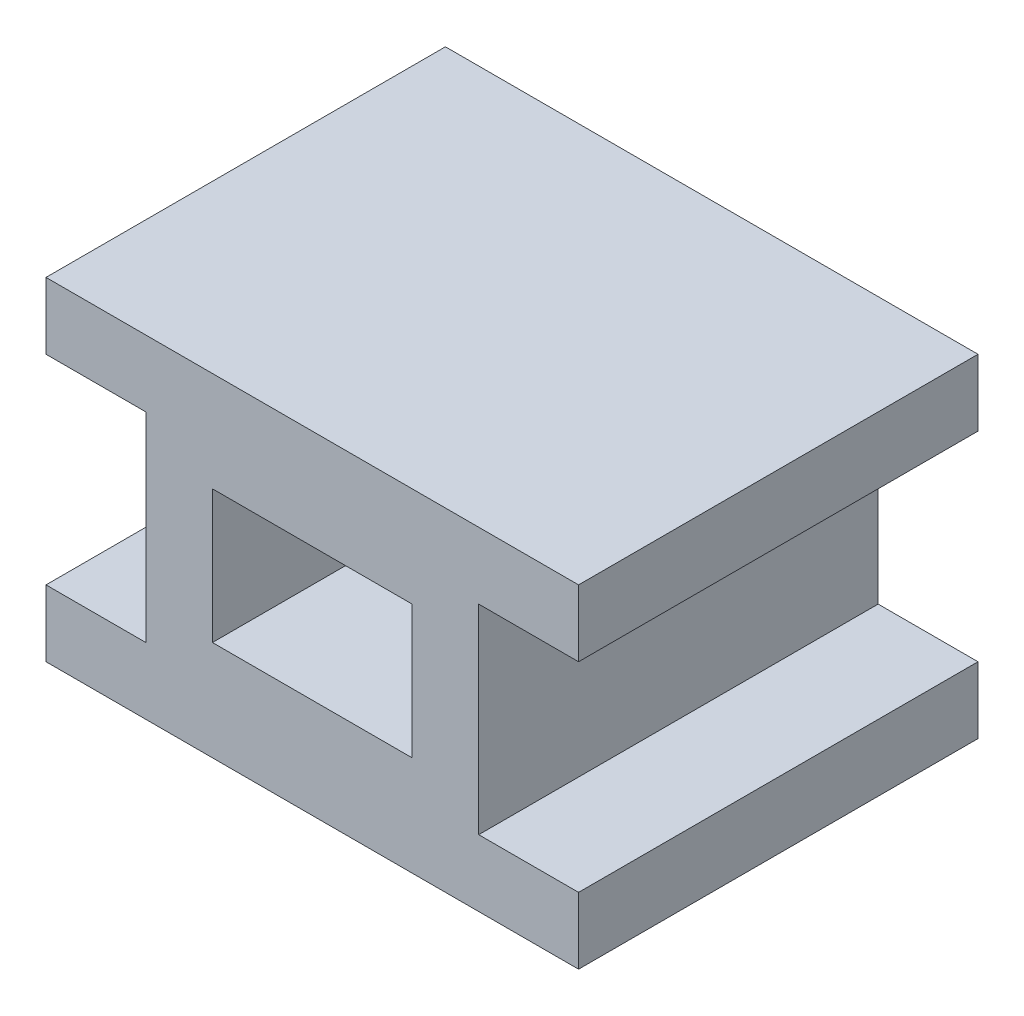
ISO-10303-21;
HEADER;
FILE_DESCRIPTION(('STEP AP214'),'2;1');
FILE_NAME('part.step','',(''),(''),'','','');
FILE_SCHEMA(('AUTOMOTIVE_DESIGN { 1 0 10303 214 1 1 1 1 }'));
ENDSEC;
DATA;
#1=APPLICATION_CONTEXT('core data for automotive mechanical design processes');
#2=APPLICATION_PROTOCOL_DEFINITION('international standard','automotive_design',2000,#1);
#3=PRODUCT_CONTEXT('',#1,'mechanical');
#4=PRODUCT('Part','Part','',(#3));
#5=PRODUCT_RELATED_PRODUCT_CATEGORY('part','',(#4));
#6=PRODUCT_DEFINITION_FORMATION('','',#4);
#7=PRODUCT_DEFINITION_CONTEXT('part definition',#1,'design');
#8=PRODUCT_DEFINITION('design','',#6,#7);
#9=PRODUCT_DEFINITION_SHAPE('','',#8);
#10=(LENGTH_UNIT() NAMED_UNIT(*) SI_UNIT(.MILLI.,.METRE.));
#11=(NAMED_UNIT(*) PLANE_ANGLE_UNIT() SI_UNIT($,.RADIAN.));
#12=(NAMED_UNIT(*) SI_UNIT($,.STERADIAN.) SOLID_ANGLE_UNIT());
#13=UNCERTAINTY_MEASURE_WITH_UNIT(LENGTH_MEASURE(1.E-05),#10,'distance_accuracy_value','');
#14=(GEOMETRIC_REPRESENTATION_CONTEXT(3) GLOBAL_UNCERTAINTY_ASSIGNED_CONTEXT((#13)) GLOBAL_UNIT_ASSIGNED_CONTEXT((#10,
#11,#12)) REPRESENTATION_CONTEXT('',''));
#15=CARTESIAN_POINT('',(0.,0.,0.));
#16=DIRECTION('',(0.,0.,1.));
#17=DIRECTION('',(1.,0.,0.));
#18=AXIS2_PLACEMENT_3D('',#15,#16,#17);
#19=CARTESIAN_POINT('',(0.,0.,30.));
#20=DIRECTION('',(0.,0.,-1.));
#21=DIRECTION('',(-1.,0.,0.));
#22=AXIS2_PLACEMENT_3D('',#19,#20,#21);
#23=PLANE('',#22);
#24=DIRECTION('',(0.,-1.,0.));
#25=VECTOR('',#24,1.);
#26=CARTESIAN_POINT('',(-46.7704918032787,-36.4426229508197,30.));
#27=LINE('',#26,#25);
#28=CARTESIAN_POINT('',(-46.7704918032787,-26.4426229508197,30.));
#29=VERTEX_POINT('',#28);
#30=CARTESIAN_POINT('',(-46.7704918032787,-36.4426229508197,30.));
#31=VERTEX_POINT('',#30);
#32=EDGE_CURVE('E205',#29,#31,#27,.T.);
#33=ORIENTED_EDGE('',*,*,#32,.T.);
#34=DIRECTION('',(1.,0.,0.));
#35=VECTOR('',#34,1.);
#36=CARTESIAN_POINT('',(33.2295081967213,-36.4426229508197,30.));
#37=LINE('',#36,#35);
#38=CARTESIAN_POINT('',(33.2295081967213,-36.4426229508197,30.));
#39=VERTEX_POINT('',#38);
#40=EDGE_CURVE('E209',#31,#39,#37,.T.);
#41=ORIENTED_EDGE('',*,*,#40,.T.);
#42=DIRECTION('',(0.,1.,0.));
#43=VECTOR('',#42,1.);
#44=CARTESIAN_POINT('',(33.2295081967213,-36.4426229508197,30.));
#45=LINE('',#44,#43);
#46=CARTESIAN_POINT('',(33.2295081967213,-26.4426229508197,30.));
#47=VERTEX_POINT('',#46);
#48=EDGE_CURVE('E213',#39,#47,#45,.T.);
#49=ORIENTED_EDGE('',*,*,#48,.T.);
#50=DIRECTION('',(-1.,0.,0.));
#51=VECTOR('',#50,1.);
#52=CARTESIAN_POINT('',(33.2295081967213,-26.4426229508197,30.));
#53=LINE('',#52,#51);
#54=CARTESIAN_POINT('',(18.2295081967213,-26.4426229508197,30.));
#55=VERTEX_POINT('',#54);
#56=EDGE_CURVE('E216',#47,#55,#53,.T.);
#57=ORIENTED_EDGE('',*,*,#56,.T.);
#58=DIRECTION('',(0.,1.,0.));
#59=VECTOR('',#58,1.);
#60=CARTESIAN_POINT('',(18.2295081967213,-26.4426229508197,30.));
#61=LINE('',#60,#59);
#62=CARTESIAN_POINT('',(18.2295081967213,3.55737704918032,30.));
#63=VERTEX_POINT('',#62);
#64=EDGE_CURVE('E219',#55,#63,#61,.T.);
#65=ORIENTED_EDGE('',*,*,#64,.T.);
#66=DIRECTION('',(1.,0.,0.));
#67=VECTOR('',#66,1.);
#68=CARTESIAN_POINT('',(18.2295081967213,3.55737704918032,30.));
#69=LINE('',#68,#67);
#70=CARTESIAN_POINT('',(33.2295081967213,3.55737704918032,30.));
#71=VERTEX_POINT('',#70);
#72=EDGE_CURVE('E222',#63,#71,#69,.T.);
#73=ORIENTED_EDGE('',*,*,#72,.T.);
#74=DIRECTION('',(0.,1.,0.));
#75=VECTOR('',#74,1.);
#76=CARTESIAN_POINT('',(33.2295081967213,3.55737704918032,30.));
#77=LINE('',#76,#75);
#78=CARTESIAN_POINT('',(33.2295081967213,13.5573770491803,30.));
#79=VERTEX_POINT('',#78);
#80=EDGE_CURVE('E225',#71,#79,#77,.T.);
#81=ORIENTED_EDGE('',*,*,#80,.T.);
#82=DIRECTION('',(-1.,0.,0.));
#83=VECTOR('',#82,1.);
#84=CARTESIAN_POINT('',(-46.7704918032787,13.5573770491803,30.));
#85=LINE('',#84,#83);
#86=CARTESIAN_POINT('',(-46.7704918032787,13.5573770491803,30.));
#87=VERTEX_POINT('',#86);
#88=EDGE_CURVE('E228',#79,#87,#85,.T.);
#89=ORIENTED_EDGE('',*,*,#88,.T.);
#90=DIRECTION('',(0.,-1.,0.));
#91=VECTOR('',#90,1.);
#92=CARTESIAN_POINT('',(-46.7704918032787,3.55737704918032,30.));
#93=LINE('',#92,#91);
#94=CARTESIAN_POINT('',(-46.7704918032787,3.55737704918032,30.));
#95=VERTEX_POINT('',#94);
#96=EDGE_CURVE('E231',#87,#95,#93,.T.);
#97=ORIENTED_EDGE('',*,*,#96,.T.);
#98=DIRECTION('',(1.,0.,0.));
#99=VECTOR('',#98,1.);
#100=CARTESIAN_POINT('',(-31.7704918032787,3.55737704918032,30.));
#101=LINE('',#100,#99);
#102=CARTESIAN_POINT('',(-31.7704918032787,3.55737704918032,30.));
#103=VERTEX_POINT('',#102);
#104=EDGE_CURVE('E234',#95,#103,#101,.T.);
#105=ORIENTED_EDGE('',*,*,#104,.T.);
#106=DIRECTION('',(0.,-1.,0.));
#107=VECTOR('',#106,1.);
#108=CARTESIAN_POINT('',(-31.7704918032787,-26.4426229508197,30.));
#109=LINE('',#108,#107);
#110=CARTESIAN_POINT('',(-31.7704918032787,-26.4426229508197,30.));
#111=VERTEX_POINT('',#110);
#112=EDGE_CURVE('E237',#103,#111,#109,.T.);
#113=ORIENTED_EDGE('',*,*,#112,.T.);
#114=DIRECTION('',(-1.,0.,0.));
#115=VECTOR('',#114,1.);
#116=CARTESIAN_POINT('',(-46.7704918032787,-26.4426229508197,30.));
#117=LINE('',#116,#115);
#118=EDGE_CURVE('E240',#111,#29,#117,.T.);
#119=ORIENTED_EDGE('',*,*,#118,.T.);
#120=EDGE_LOOP('',(#33,#41,#49,#57,#65,#73,#81,#89,#97,#105,#113,#119));
#121=FACE_BOUND('',#120,.T.);
#122=DIRECTION('',(0.,-1.,0.));
#123=VECTOR('',#122,1.);
#124=CARTESIAN_POINT('',(-21.7704918032787,-1.44262295081968,30.));
#125=LINE('',#124,#123);
#126=CARTESIAN_POINT('',(-21.7704918032787,-1.44262295081968,30.));
#127=VERTEX_POINT('',#126);
#128=CARTESIAN_POINT('',(-21.7704918032787,-21.4426229508197,30.));
#129=VERTEX_POINT('',#128);
#130=EDGE_CURVE('E157',#127,#129,#125,.T.);
#131=ORIENTED_EDGE('',*,*,#130,.F.);
#132=DIRECTION('',(-1.,0.,0.));
#133=VECTOR('',#132,1.);
#134=CARTESIAN_POINT('',(-21.7704918032787,-1.44262295081968,30.));
#135=LINE('',#134,#133);
#136=CARTESIAN_POINT('',(8.22950819672134,-1.44262295081967,30.));
#137=VERTEX_POINT('',#136);
#138=EDGE_CURVE('E183',#137,#127,#135,.T.);
#139=ORIENTED_EDGE('',*,*,#138,.F.);
#140=DIRECTION('',(0.,1.,0.));
#141=VECTOR('',#140,1.);
#142=CARTESIAN_POINT('',(8.22950819672134,-1.44262295081967,30.));
#143=LINE('',#142,#141);
#144=CARTESIAN_POINT('',(8.22950819672134,-21.4426229508197,30.));
#145=VERTEX_POINT('',#144);
#146=EDGE_CURVE('E179',#145,#137,#143,.T.);
#147=ORIENTED_EDGE('',*,*,#146,.F.);
#148=DIRECTION('',(1.,0.,0.));
#149=VECTOR('',#148,1.);
#150=CARTESIAN_POINT('',(-21.7704918032787,-21.4426229508197,30.));
#151=LINE('',#150,#149);
#152=EDGE_CURVE('E166',#129,#145,#151,.T.);
#153=ORIENTED_EDGE('',*,*,#152,.F.);
#154=EDGE_LOOP('',(#131,#139,#147,#153));
#155=FACE_BOUND('',#154,.T.);
#156=ADVANCED_FACE('F43',(#121,#155),#23,.F.);
#157=CARTESIAN_POINT('',(0.,0.,-30.));
#158=DIRECTION('',(0.,0.,-1.));
#159=DIRECTION('',(-1.,0.,0.));
#160=AXIS2_PLACEMENT_3D('',#157,#158,#159);
#161=PLANE('',#160);
#162=DIRECTION('',(0.,-1.,0.));
#163=VECTOR('',#162,1.);
#164=CARTESIAN_POINT('',(-46.7704918032787,-36.4426229508197,-30.));
#165=LINE('',#164,#163);
#166=CARTESIAN_POINT('',(-46.7704918032787,-26.4426229508197,-30.));
#167=VERTEX_POINT('',#166);
#168=CARTESIAN_POINT('',(-46.7704918032787,-36.4426229508197,-30.));
#169=VERTEX_POINT('',#168);
#170=EDGE_CURVE('E175',#167,#169,#165,.T.);
#171=ORIENTED_EDGE('',*,*,#170,.F.);
#172=DIRECTION('',(-1.,0.,0.));
#173=VECTOR('',#172,1.);
#174=CARTESIAN_POINT('',(-46.7704918032787,-26.4426229508197,-30.));
#175=LINE('',#174,#173);
#176=CARTESIAN_POINT('',(-31.7704918032787,-26.4426229508197,-30.));
#177=VERTEX_POINT('',#176);
#178=EDGE_CURVE('E210',#177,#167,#175,.T.);
#179=ORIENTED_EDGE('',*,*,#178,.F.);
#180=DIRECTION('',(0.,-1.,0.));
#181=VECTOR('',#180,1.);
#182=CARTESIAN_POINT('',(-31.7704918032787,-26.4426229508197,-30.));
#183=LINE('',#182,#181);
#184=CARTESIAN_POINT('',(-31.7704918032787,3.55737704918032,-30.));
#185=VERTEX_POINT('',#184);
#186=EDGE_CURVE('E274',#185,#177,#183,.T.);
#187=ORIENTED_EDGE('',*,*,#186,.F.);
#188=DIRECTION('',(1.,0.,0.));
#189=VECTOR('',#188,1.);
#190=CARTESIAN_POINT('',(-31.7704918032787,3.55737704918032,-30.));
#191=LINE('',#190,#189);
#192=CARTESIAN_POINT('',(-46.7704918032787,3.55737704918032,-30.));
#193=VERTEX_POINT('',#192);
#194=EDGE_CURVE('E271',#193,#185,#191,.T.);
#195=ORIENTED_EDGE('',*,*,#194,.F.);
#196=DIRECTION('',(0.,-1.,0.));
#197=VECTOR('',#196,1.);
#198=CARTESIAN_POINT('',(-46.7704918032787,3.55737704918032,-30.));
#199=LINE('',#198,#197);
#200=CARTESIAN_POINT('',(-46.7704918032787,13.5573770491803,-30.));
#201=VERTEX_POINT('',#200);
#202=EDGE_CURVE('E268',#201,#193,#199,.T.);
#203=ORIENTED_EDGE('',*,*,#202,.F.);
#204=DIRECTION('',(-1.,0.,0.));
#205=VECTOR('',#204,1.);
#206=CARTESIAN_POINT('',(-46.7704918032787,13.5573770491803,-30.));
#207=LINE('',#206,#205);
#208=CARTESIAN_POINT('',(33.2295081967213,13.5573770491803,-30.));
#209=VERTEX_POINT('',#208);
#210=EDGE_CURVE('E265',#209,#201,#207,.T.);
#211=ORIENTED_EDGE('',*,*,#210,.F.);
#212=DIRECTION('',(0.,1.,0.));
#213=VECTOR('',#212,1.);
#214=CARTESIAN_POINT('',(33.2295081967213,3.55737704918032,-30.));
#215=LINE('',#214,#213);
#216=CARTESIAN_POINT('',(33.2295081967213,3.55737704918032,-30.));
#217=VERTEX_POINT('',#216);
#218=EDGE_CURVE('E262',#217,#209,#215,.T.);
#219=ORIENTED_EDGE('',*,*,#218,.F.);
#220=DIRECTION('',(1.,0.,0.));
#221=VECTOR('',#220,1.);
#222=CARTESIAN_POINT('',(18.2295081967213,3.55737704918032,-30.));
#223=LINE('',#222,#221);
#224=CARTESIAN_POINT('',(18.2295081967213,3.55737704918032,-30.));
#225=VERTEX_POINT('',#224);
#226=EDGE_CURVE('E259',#225,#217,#223,.T.);
#227=ORIENTED_EDGE('',*,*,#226,.F.);
#228=DIRECTION('',(0.,1.,0.));
#229=VECTOR('',#228,1.);
#230=CARTESIAN_POINT('',(18.2295081967213,-26.4426229508197,-30.));
#231=LINE('',#230,#229);
#232=CARTESIAN_POINT('',(18.2295081967213,-26.4426229508197,-30.));
#233=VERTEX_POINT('',#232);
#234=EDGE_CURVE('E256',#233,#225,#231,.T.);
#235=ORIENTED_EDGE('',*,*,#234,.F.);
#236=DIRECTION('',(-1.,0.,0.));
#237=VECTOR('',#236,1.);
#238=CARTESIAN_POINT('',(33.2295081967213,-26.4426229508197,-30.));
#239=LINE('',#238,#237);
#240=CARTESIAN_POINT('',(33.2295081967213,-26.4426229508197,-30.));
#241=VERTEX_POINT('',#240);
#242=EDGE_CURVE('E253',#241,#233,#239,.T.);
#243=ORIENTED_EDGE('',*,*,#242,.F.);
#244=DIRECTION('',(0.,1.,0.));
#245=VECTOR('',#244,1.);
#246=CARTESIAN_POINT('',(33.2295081967213,-36.4426229508197,-30.));
#247=LINE('',#246,#245);
#248=CARTESIAN_POINT('',(33.2295081967213,-36.4426229508197,-30.));
#249=VERTEX_POINT('',#248);
#250=EDGE_CURVE('E250',#249,#241,#247,.T.);
#251=ORIENTED_EDGE('',*,*,#250,.F.);
#252=DIRECTION('',(1.,0.,0.));
#253=VECTOR('',#252,1.);
#254=CARTESIAN_POINT('',(33.2295081967213,-36.4426229508197,-30.));
#255=LINE('',#254,#253);
#256=EDGE_CURVE('E247',#169,#249,#255,.T.);
#257=ORIENTED_EDGE('',*,*,#256,.F.);
#258=EDGE_LOOP('',(#171,#179,#187,#195,#203,#211,#219,#227,#235,#243,#251,#257));
#259=FACE_BOUND('',#258,.T.);
#260=DIRECTION('',(-1.,0.,0.));
#261=VECTOR('',#260,1.);
#262=CARTESIAN_POINT('',(-21.7704918032787,-1.44262295081968,-30.));
#263=LINE('',#262,#261);
#264=CARTESIAN_POINT('',(8.22950819672134,-1.44262295081967,-30.));
#265=VERTEX_POINT('',#264);
#266=CARTESIAN_POINT('',(-21.7704918032787,-1.44262295081968,-30.));
#267=VERTEX_POINT('',#266);
#268=EDGE_CURVE('E167',#265,#267,#263,.T.);
#269=ORIENTED_EDGE('',*,*,#268,.T.);
#270=DIRECTION('',(0.,-1.,0.));
#271=VECTOR('',#270,1.);
#272=CARTESIAN_POINT('',(-21.7704918032787,-1.44262295081968,-30.));
#273=LINE('',#272,#271);
#274=CARTESIAN_POINT('',(-21.7704918032787,-21.4426229508197,-30.));
#275=VERTEX_POINT('',#274);
#276=EDGE_CURVE('E67',#267,#275,#273,.T.);
#277=ORIENTED_EDGE('',*,*,#276,.T.);
#278=DIRECTION('',(1.,0.,0.));
#279=VECTOR('',#278,1.);
#280=CARTESIAN_POINT('',(-21.7704918032787,-21.4426229508197,-30.));
#281=LINE('',#280,#279);
#282=CARTESIAN_POINT('',(8.22950819672134,-21.4426229508197,-30.));
#283=VERTEX_POINT('',#282);
#284=EDGE_CURVE('E173',#275,#283,#281,.T.);
#285=ORIENTED_EDGE('',*,*,#284,.T.);
#286=DIRECTION('',(0.,1.,0.));
#287=VECTOR('',#286,1.);
#288=CARTESIAN_POINT('',(8.22950819672134,-1.44262295081967,-30.));
#289=LINE('',#288,#287);
#290=EDGE_CURVE('E192',#283,#265,#289,.T.);
#291=ORIENTED_EDGE('',*,*,#290,.T.);
#292=EDGE_LOOP('',(#269,#277,#285,#291));
#293=FACE_BOUND('',#292,.T.);
#294=ADVANCED_FACE('F329',(#259,#293),#161,.T.);
#295=CARTESIAN_POINT('',(-46.7704918032787,-36.4426229508197,30.));
#296=DIRECTION('',(1.,0.,0.));
#297=DIRECTION('',(0.,0.,-1.));
#298=AXIS2_PLACEMENT_3D('',#295,#296,#297);
#299=PLANE('',#298);
#300=ORIENTED_EDGE('',*,*,#170,.T.);
#301=DIRECTION('',(0.,0.,-1.));
#302=VECTOR('',#301,1.);
#303=CARTESIAN_POINT('',(-46.7704918032787,-36.4426229508197,30.));
#304=LINE('',#303,#302);
#305=EDGE_CURVE('E11',#31,#169,#304,.T.);
#306=ORIENTED_EDGE('',*,*,#305,.F.);
#307=ORIENTED_EDGE('',*,*,#32,.F.);
#308=DIRECTION('',(0.,0.,-1.));
#309=VECTOR('',#308,1.);
#310=CARTESIAN_POINT('',(-46.7704918032787,-26.4426229508197,30.));
#311=LINE('',#310,#309);
#312=EDGE_CURVE('E243',#29,#167,#311,.T.);
#313=ORIENTED_EDGE('',*,*,#312,.T.);
#314=EDGE_LOOP('',(#300,#306,#307,#313));
#315=FACE_BOUND('',#314,.T.);
#316=ADVANCED_FACE('F45',(#315),#299,.F.);
#317=CARTESIAN_POINT('',(33.2295081967213,-36.4426229508197,30.));
#318=DIRECTION('',(0.,1.,0.));
#319=DIRECTION('',(-1.,0.,0.));
#320=AXIS2_PLACEMENT_3D('',#317,#318,#319);
#321=PLANE('',#320);
#322=ORIENTED_EDGE('',*,*,#256,.T.);
#323=DIRECTION('',(0.,0.,-1.));
#324=VECTOR('',#323,1.);
#325=CARTESIAN_POINT('',(33.2295081967213,-36.4426229508197,30.));
#326=LINE('',#325,#324);
#327=EDGE_CURVE('E52',#39,#249,#326,.T.);
#328=ORIENTED_EDGE('',*,*,#327,.F.);
#329=ORIENTED_EDGE('',*,*,#40,.F.);
#330=ORIENTED_EDGE('',*,*,#305,.T.);
#331=EDGE_LOOP('',(#322,#328,#329,#330));
#332=FACE_BOUND('',#331,.T.);
#333=ADVANCED_FACE('F346',(#332),#321,.F.);
#334=CARTESIAN_POINT('',(33.2295081967213,-36.4426229508197,30.));
#335=DIRECTION('',(-1.,0.,0.));
#336=DIRECTION('',(0.,0.,1.));
#337=AXIS2_PLACEMENT_3D('',#334,#335,#336);
#338=PLANE('',#337);
#339=ORIENTED_EDGE('',*,*,#250,.T.);
#340=DIRECTION('',(0.,0.,-1.));
#341=VECTOR('',#340,1.);
#342=CARTESIAN_POINT('',(33.2295081967213,-26.4426229508197,30.));
#343=LINE('',#342,#341);
#344=EDGE_CURVE('E314',#47,#241,#343,.T.);
#345=ORIENTED_EDGE('',*,*,#344,.F.);
#346=ORIENTED_EDGE('',*,*,#48,.F.);
#347=ORIENTED_EDGE('',*,*,#327,.T.);
#348=EDGE_LOOP('',(#339,#345,#346,#347));
#349=FACE_BOUND('',#348,.T.);
#350=ADVANCED_FACE('F323',(#349),#338,.F.);
#351=CARTESIAN_POINT('',(33.2295081967213,-26.4426229508197,30.));
#352=DIRECTION('',(0.,-1.,0.));
#353=DIRECTION('',(1.,0.,0.));
#354=AXIS2_PLACEMENT_3D('',#351,#352,#353);
#355=PLANE('',#354);
#356=ORIENTED_EDGE('',*,*,#242,.T.);
#357=DIRECTION('',(0.,0.,-1.));
#358=VECTOR('',#357,1.);
#359=CARTESIAN_POINT('',(18.2295081967213,-26.4426229508197,30.));
#360=LINE('',#359,#358);
#361=EDGE_CURVE('E310',#55,#233,#360,.T.);
#362=ORIENTED_EDGE('',*,*,#361,.F.);
#363=ORIENTED_EDGE('',*,*,#56,.F.);
#364=ORIENTED_EDGE('',*,*,#344,.T.);
#365=EDGE_LOOP('',(#356,#362,#363,#364));
#366=FACE_BOUND('',#365,.T.);
#367=ADVANCED_FACE('F335',(#366),#355,.F.);
#368=CARTESIAN_POINT('',(18.2295081967213,-26.4426229508197,30.));
#369=DIRECTION('',(-1.,0.,0.));
#370=DIRECTION('',(0.,-1.,0.));
#371=AXIS2_PLACEMENT_3D('',#368,#369,#370);
#372=PLANE('',#371);
#373=ORIENTED_EDGE('',*,*,#234,.T.);
#374=DIRECTION('',(0.,0.,-1.));
#375=VECTOR('',#374,1.);
#376=CARTESIAN_POINT('',(18.2295081967213,3.55737704918032,30.));
#377=LINE('',#376,#375);
#378=EDGE_CURVE('E306',#63,#225,#377,.T.);
#379=ORIENTED_EDGE('',*,*,#378,.F.);
#380=ORIENTED_EDGE('',*,*,#64,.F.);
#381=ORIENTED_EDGE('',*,*,#361,.T.);
#382=EDGE_LOOP('',(#373,#379,#380,#381));
#383=FACE_BOUND('',#382,.T.);
#384=ADVANCED_FACE('F339',(#383),#372,.F.);
#385=CARTESIAN_POINT('',(18.2295081967213,3.55737704918032,30.));
#386=DIRECTION('',(0.,1.,0.));
#387=DIRECTION('',(-1.,0.,0.));
#388=AXIS2_PLACEMENT_3D('',#385,#386,#387);
#389=PLANE('',#388);
#390=ORIENTED_EDGE('',*,*,#226,.T.);
#391=DIRECTION('',(0.,0.,-1.));
#392=VECTOR('',#391,1.);
#393=CARTESIAN_POINT('',(33.2295081967213,3.55737704918032,30.));
#394=LINE('',#393,#392);
#395=EDGE_CURVE('E302',#71,#217,#394,.T.);
#396=ORIENTED_EDGE('',*,*,#395,.F.);
#397=ORIENTED_EDGE('',*,*,#72,.F.);
#398=ORIENTED_EDGE('',*,*,#378,.T.);
#399=EDGE_LOOP('',(#390,#396,#397,#398));
#400=FACE_BOUND('',#399,.T.);
#401=ADVANCED_FACE('F379',(#400),#389,.F.);
#402=CARTESIAN_POINT('',(33.2295081967213,3.55737704918032,30.));
#403=DIRECTION('',(-1.,0.,0.));
#404=DIRECTION('',(0.,-1.,0.));
#405=AXIS2_PLACEMENT_3D('',#402,#403,#404);
#406=PLANE('',#405);
#407=ORIENTED_EDGE('',*,*,#218,.T.);
#408=DIRECTION('',(0.,0.,-1.));
#409=VECTOR('',#408,1.);
#410=CARTESIAN_POINT('',(33.2295081967213,13.5573770491803,30.));
#411=LINE('',#410,#409);
#412=EDGE_CURVE('E298',#79,#209,#411,.T.);
#413=ORIENTED_EDGE('',*,*,#412,.F.);
#414=ORIENTED_EDGE('',*,*,#80,.F.);
#415=ORIENTED_EDGE('',*,*,#395,.T.);
#416=EDGE_LOOP('',(#407,#413,#414,#415));
#417=FACE_BOUND('',#416,.T.);
#418=ADVANCED_FACE('F377',(#417),#406,.F.);
#419=CARTESIAN_POINT('',(-46.7704918032787,13.5573770491803,30.));
#420=DIRECTION('',(0.,-1.,0.));
#421=DIRECTION('',(1.,0.,0.));
#422=AXIS2_PLACEMENT_3D('',#419,#420,#421);
#423=PLANE('',#422);
#424=ORIENTED_EDGE('',*,*,#210,.T.);
#425=DIRECTION('',(0.,0.,-1.));
#426=VECTOR('',#425,1.);
#427=CARTESIAN_POINT('',(-46.7704918032787,13.5573770491803,30.));
#428=LINE('',#427,#426);
#429=EDGE_CURVE('E294',#87,#201,#428,.T.);
#430=ORIENTED_EDGE('',*,*,#429,.F.);
#431=ORIENTED_EDGE('',*,*,#88,.F.);
#432=ORIENTED_EDGE('',*,*,#412,.T.);
#433=EDGE_LOOP('',(#424,#430,#431,#432));
#434=FACE_BOUND('',#433,.T.);
#435=ADVANCED_FACE('F373',(#434),#423,.F.);
#436=CARTESIAN_POINT('',(-46.7704918032787,3.55737704918032,30.));
#437=DIRECTION('',(1.,0.,0.));
#438=DIRECTION('',(0.,1.,0.));
#439=AXIS2_PLACEMENT_3D('',#436,#437,#438);
#440=PLANE('',#439);
#441=ORIENTED_EDGE('',*,*,#202,.T.);
#442=DIRECTION('',(0.,0.,-1.));
#443=VECTOR('',#442,1.);
#444=CARTESIAN_POINT('',(-46.7704918032787,3.55737704918032,30.));
#445=LINE('',#444,#443);
#446=EDGE_CURVE('E290',#95,#193,#445,.T.);
#447=ORIENTED_EDGE('',*,*,#446,.F.);
#448=ORIENTED_EDGE('',*,*,#96,.F.);
#449=ORIENTED_EDGE('',*,*,#429,.T.);
#450=EDGE_LOOP('',(#441,#447,#448,#449));
#451=FACE_BOUND('',#450,.T.);
#452=ADVANCED_FACE('F368',(#451),#440,.F.);
#453=CARTESIAN_POINT('',(-31.7704918032787,3.55737704918032,30.));
#454=DIRECTION('',(0.,1.,0.));
#455=DIRECTION('',(-1.,0.,0.));
#456=AXIS2_PLACEMENT_3D('',#453,#454,#455);
#457=PLANE('',#456);
#458=ORIENTED_EDGE('',*,*,#194,.T.);
#459=DIRECTION('',(0.,0.,-1.));
#460=VECTOR('',#459,1.);
#461=CARTESIAN_POINT('',(-31.7704918032787,3.55737704918032,30.));
#462=LINE('',#461,#460);
#463=EDGE_CURVE('E286',#103,#185,#462,.T.);
#464=ORIENTED_EDGE('',*,*,#463,.F.);
#465=ORIENTED_EDGE('',*,*,#104,.F.);
#466=ORIENTED_EDGE('',*,*,#446,.T.);
#467=EDGE_LOOP('',(#458,#464,#465,#466));
#468=FACE_BOUND('',#467,.T.);
#469=ADVANCED_FACE('F362',(#468),#457,.F.);
#470=CARTESIAN_POINT('',(-31.7704918032787,-26.4426229508197,30.));
#471=DIRECTION('',(1.,0.,0.));
#472=DIRECTION('',(0.,0.,-1.));
#473=AXIS2_PLACEMENT_3D('',#470,#471,#472);
#474=PLANE('',#473);
#475=ORIENTED_EDGE('',*,*,#186,.T.);
#476=DIRECTION('',(0.,0.,-1.));
#477=VECTOR('',#476,1.);
#478=CARTESIAN_POINT('',(-31.7704918032787,-26.4426229508197,30.));
#479=LINE('',#478,#477);
#480=EDGE_CURVE('E282',#111,#177,#479,.T.);
#481=ORIENTED_EDGE('',*,*,#480,.F.);
#482=ORIENTED_EDGE('',*,*,#112,.F.);
#483=ORIENTED_EDGE('',*,*,#463,.T.);
#484=EDGE_LOOP('',(#475,#481,#482,#483));
#485=FACE_BOUND('',#484,.T.);
#486=ADVANCED_FACE('F358',(#485),#474,.F.);
#487=CARTESIAN_POINT('',(-46.7704918032787,-26.4426229508197,30.));
#488=DIRECTION('',(0.,-1.,0.));
#489=DIRECTION('',(0.,0.,-1.));
#490=AXIS2_PLACEMENT_3D('',#487,#488,#489);
#491=PLANE('',#490);
#492=ORIENTED_EDGE('',*,*,#178,.T.);
#493=ORIENTED_EDGE('',*,*,#312,.F.);
#494=ORIENTED_EDGE('',*,*,#118,.F.);
#495=ORIENTED_EDGE('',*,*,#480,.T.);
#496=EDGE_LOOP('',(#492,#493,#494,#495));
#497=FACE_BOUND('',#496,.T.);
#498=ADVANCED_FACE('F353',(#497),#491,.F.);
#499=CARTESIAN_POINT('',(-21.7704918032787,-1.44262295081968,30.));
#500=DIRECTION('',(1.,0.,0.));
#501=DIRECTION('',(0.,1.,0.));
#502=AXIS2_PLACEMENT_3D('',#499,#500,#501);
#503=PLANE('',#502);
#504=ORIENTED_EDGE('',*,*,#276,.F.);
#505=DIRECTION('',(0.,0.,-1.));
#506=VECTOR('',#505,1.);
#507=CARTESIAN_POINT('',(-21.7704918032787,-1.44262295081968,30.));
#508=LINE('',#507,#506);
#509=EDGE_CURVE('E161',#127,#267,#508,.T.);
#510=ORIENTED_EDGE('',*,*,#509,.F.);
#511=ORIENTED_EDGE('',*,*,#130,.T.);
#512=DIRECTION('',(0.,0.,-1.));
#513=VECTOR('',#512,1.);
#514=CARTESIAN_POINT('',(-21.7704918032787,-21.4426229508197,30.));
#515=LINE('',#514,#513);
#516=EDGE_CURVE('E160',#129,#275,#515,.T.);
#517=ORIENTED_EDGE('',*,*,#516,.T.);
#518=EDGE_LOOP('',(#504,#510,#511,#517));
#519=FACE_BOUND('',#518,.T.);
#520=ADVANCED_FACE('F159',(#519),#503,.T.);
#521=CARTESIAN_POINT('',(-21.7704918032787,-21.4426229508197,30.));
#522=DIRECTION('',(0.,1.,0.));
#523=DIRECTION('',(0.,0.,1.));
#524=AXIS2_PLACEMENT_3D('',#521,#522,#523);
#525=PLANE('',#524);
#526=ORIENTED_EDGE('',*,*,#284,.F.);
#527=ORIENTED_EDGE('',*,*,#516,.F.);
#528=ORIENTED_EDGE('',*,*,#152,.T.);
#529=DIRECTION('',(0.,0.,-1.));
#530=VECTOR('',#529,1.);
#531=CARTESIAN_POINT('',(8.22950819672134,-21.4426229508197,30.));
#532=LINE('',#531,#530);
#533=EDGE_CURVE('E176',#145,#283,#532,.T.);
#534=ORIENTED_EDGE('',*,*,#533,.T.);
#535=EDGE_LOOP('',(#526,#527,#528,#534));
#536=FACE_BOUND('',#535,.T.);
#537=ADVANCED_FACE('F170',(#536),#525,.T.);
#538=CARTESIAN_POINT('',(8.22950819672134,-1.44262295081967,30.));
#539=DIRECTION('',(-1.,0.,0.));
#540=DIRECTION('',(0.,-1.,0.));
#541=AXIS2_PLACEMENT_3D('',#538,#539,#540);
#542=PLANE('',#541);
#543=ORIENTED_EDGE('',*,*,#290,.F.);
#544=ORIENTED_EDGE('',*,*,#533,.F.);
#545=ORIENTED_EDGE('',*,*,#146,.T.);
#546=DIRECTION('',(0.,0.,-1.));
#547=VECTOR('',#546,1.);
#548=CARTESIAN_POINT('',(8.22950819672134,-1.44262295081967,30.));
#549=LINE('',#548,#547);
#550=EDGE_CURVE('E59',#137,#265,#549,.T.);
#551=ORIENTED_EDGE('',*,*,#550,.T.);
#552=EDGE_LOOP('',(#543,#544,#545,#551));
#553=FACE_BOUND('',#552,.T.);
#554=ADVANCED_FACE('F437',(#553),#542,.T.);
#555=CARTESIAN_POINT('',(-21.7704918032787,-1.44262295081968,30.));
#556=DIRECTION('',(0.,-1.,0.));
#557=DIRECTION('',(1.,0.,0.));
#558=AXIS2_PLACEMENT_3D('',#555,#556,#557);
#559=PLANE('',#558);
#560=ORIENTED_EDGE('',*,*,#268,.F.);
#561=ORIENTED_EDGE('',*,*,#550,.F.);
#562=ORIENTED_EDGE('',*,*,#138,.T.);
#563=ORIENTED_EDGE('',*,*,#509,.T.);
#564=EDGE_LOOP('',(#560,#561,#562,#563));
#565=FACE_BOUND('',#564,.T.);
#566=ADVANCED_FACE('F443',(#565),#559,.T.);
#567=CLOSED_SHELL('',(#156,#294,#316,#333,#350,#367,#384,#401,#418,#435,#452,#469,#486,#498,
#520,#537,#554,#566));
#568=MANIFOLD_SOLID_BREP('B2',#567);
#569=ADVANCED_BREP_SHAPE_REPRESENTATION('',(#18,#568),#14);
#570=SHAPE_DEFINITION_REPRESENTATION(#9,#569);
ENDSEC;
END-ISO-10303-21;
